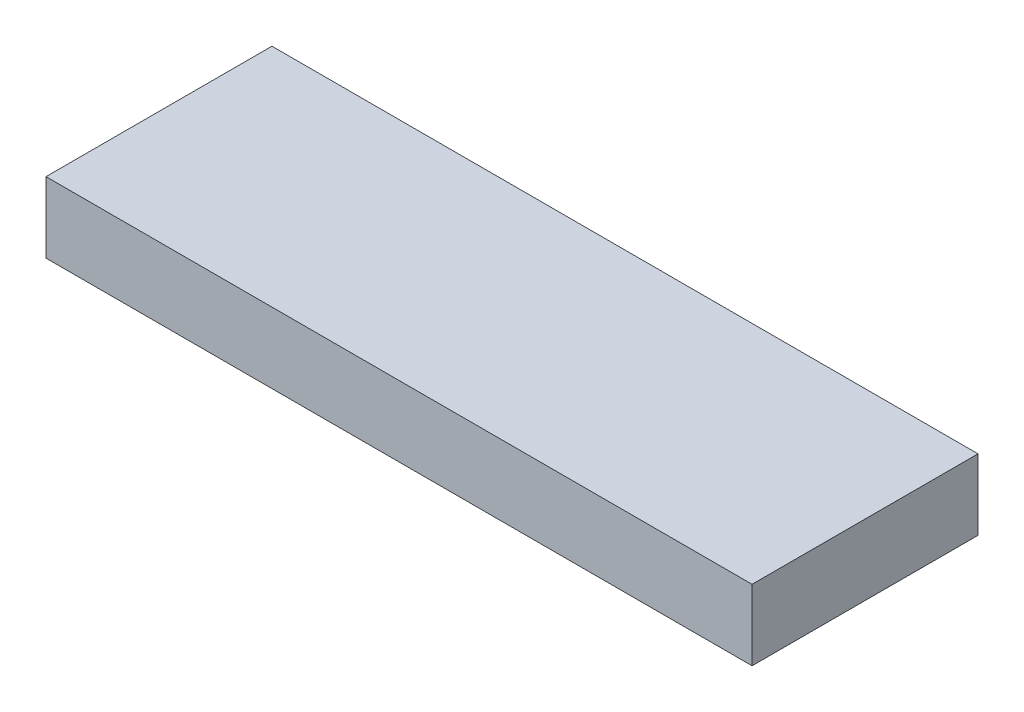
ISO-10303-21;
HEADER;
FILE_DESCRIPTION(('STEP AP214'),'2;1');
FILE_NAME('part.step','',(''),(''),'','','');
FILE_SCHEMA(('AUTOMOTIVE_DESIGN { 1 0 10303 214 1 1 1 1 }'));
ENDSEC;
DATA;
#1=APPLICATION_CONTEXT('core data for automotive mechanical design processes');
#2=APPLICATION_PROTOCOL_DEFINITION('international standard','automotive_design',2000,#1);
#3=PRODUCT_CONTEXT('',#1,'mechanical');
#4=PRODUCT('Part','Part','',(#3));
#5=PRODUCT_RELATED_PRODUCT_CATEGORY('part','',(#4));
#6=PRODUCT_DEFINITION_FORMATION('','',#4);
#7=PRODUCT_DEFINITION_CONTEXT('part definition',#1,'design');
#8=PRODUCT_DEFINITION('design','',#6,#7);
#9=PRODUCT_DEFINITION_SHAPE('','',#8);
#10=(LENGTH_UNIT() NAMED_UNIT(*) SI_UNIT(.MILLI.,.METRE.));
#11=(NAMED_UNIT(*) PLANE_ANGLE_UNIT() SI_UNIT($,.RADIAN.));
#12=(NAMED_UNIT(*) SI_UNIT($,.STERADIAN.) SOLID_ANGLE_UNIT());
#13=UNCERTAINTY_MEASURE_WITH_UNIT(LENGTH_MEASURE(1.E-05),#10,'distance_accuracy_value','');
#14=(GEOMETRIC_REPRESENTATION_CONTEXT(3) GLOBAL_UNCERTAINTY_ASSIGNED_CONTEXT((#13)) GLOBAL_UNIT_ASSIGNED_CONTEXT((#10,
#11,#12)) REPRESENTATION_CONTEXT('',''));
#15=CARTESIAN_POINT('',(0.,0.,0.));
#16=DIRECTION('',(0.,0.,1.));
#17=DIRECTION('',(1.,0.,0.));
#18=AXIS2_PLACEMENT_3D('',#15,#16,#17);
#19=CARTESIAN_POINT('',(50.,2.5,8.));
#20=DIRECTION('',(0.,0.,-1.));
#21=DIRECTION('',(-1.,0.,0.));
#22=AXIS2_PLACEMENT_3D('',#19,#20,#21);
#23=PLANE('',#22);
#24=DIRECTION('',(0.,-1.,0.));
#25=VECTOR('',#24,1.);
#26=CARTESIAN_POINT('',(0.,2.5,8.));
#27=LINE('',#26,#25);
#28=CARTESIAN_POINT('',(0.,2.5,8.));
#29=VERTEX_POINT('',#28);
#30=CARTESIAN_POINT('',(0.,-2.5,8.));
#31=VERTEX_POINT('',#30);
#32=EDGE_CURVE('E111',#29,#31,#27,.T.);
#33=ORIENTED_EDGE('',*,*,#32,.T.);
#34=DIRECTION('',(-1.,0.,0.));
#35=VECTOR('',#34,1.);
#36=CARTESIAN_POINT('',(50.,-2.5,8.));
#37=LINE('',#36,#35);
#38=CARTESIAN_POINT('',(50.,-2.5,8.));
#39=VERTEX_POINT('',#38);
#40=EDGE_CURVE('E11',#39,#31,#37,.T.);
#41=ORIENTED_EDGE('',*,*,#40,.F.);
#42=DIRECTION('',(0.,-1.,0.));
#43=VECTOR('',#42,1.);
#44=CARTESIAN_POINT('',(50.,2.5,8.));
#45=LINE('',#44,#43);
#46=CARTESIAN_POINT('',(50.,2.5,8.));
#47=VERTEX_POINT('',#46);
#48=EDGE_CURVE('E93',#47,#39,#45,.T.);
#49=ORIENTED_EDGE('',*,*,#48,.F.);
#50=DIRECTION('',(-1.,0.,0.));
#51=VECTOR('',#50,1.);
#52=CARTESIAN_POINT('',(50.,2.5,8.));
#53=LINE('',#52,#51);
#54=EDGE_CURVE('E60',#47,#29,#53,.T.);
#55=ORIENTED_EDGE('',*,*,#54,.T.);
#56=EDGE_LOOP('',(#33,#41,#49,#55));
#57=FACE_BOUND('',#56,.T.);
#58=ADVANCED_FACE('F43',(#57),#23,.F.);
#59=CARTESIAN_POINT('',(50.,-2.5,8.));
#60=DIRECTION('',(0.,1.,0.));
#61=DIRECTION('',(0.,0.,1.));
#62=AXIS2_PLACEMENT_3D('',#59,#60,#61);
#63=PLANE('',#62);
#64=DIRECTION('',(0.,0.,-1.));
#65=VECTOR('',#64,1.);
#66=CARTESIAN_POINT('',(0.,-2.5,8.));
#67=LINE('',#66,#65);
#68=CARTESIAN_POINT('',(0.,-2.5,-8.));
#69=VERTEX_POINT('',#68);
#70=EDGE_CURVE('E99',#31,#69,#67,.T.);
#71=ORIENTED_EDGE('',*,*,#70,.T.);
#72=DIRECTION('',(-1.,0.,0.));
#73=VECTOR('',#72,1.);
#74=CARTESIAN_POINT('',(50.,-2.5,-8.));
#75=LINE('',#74,#73);
#76=CARTESIAN_POINT('',(50.,-2.5,-8.));
#77=VERTEX_POINT('',#76);
#78=EDGE_CURVE('E52',#77,#69,#75,.T.);
#79=ORIENTED_EDGE('',*,*,#78,.F.);
#80=DIRECTION('',(0.,0.,-1.));
#81=VECTOR('',#80,1.);
#82=CARTESIAN_POINT('',(50.,-2.5,8.));
#83=LINE('',#82,#81);
#84=EDGE_CURVE('E85',#39,#77,#83,.T.);
#85=ORIENTED_EDGE('',*,*,#84,.F.);
#86=ORIENTED_EDGE('',*,*,#40,.T.);
#87=EDGE_LOOP('',(#71,#79,#85,#86));
#88=FACE_BOUND('',#87,.T.);
#89=ADVANCED_FACE('F98',(#88),#63,.F.);
#90=CARTESIAN_POINT('',(50.,2.5,-8.));
#91=DIRECTION('',(0.,0.,-1.));
#92=DIRECTION('',(0.,1.,0.));
#93=AXIS2_PLACEMENT_3D('',#90,#91,#92);
#94=PLANE('',#93);
#95=DIRECTION('',(0.,-1.,0.));
#96=VECTOR('',#95,1.);
#97=CARTESIAN_POINT('',(0.,2.5,-8.));
#98=LINE('',#97,#96);
#99=CARTESIAN_POINT('',(0.,2.5,-8.));
#100=VERTEX_POINT('',#99);
#101=EDGE_CURVE('E116',#100,#69,#98,.T.);
#102=ORIENTED_EDGE('',*,*,#101,.F.);
#103=DIRECTION('',(-1.,0.,0.));
#104=VECTOR('',#103,1.);
#105=CARTESIAN_POINT('',(50.,2.5,-8.));
#106=LINE('',#105,#104);
#107=CARTESIAN_POINT('',(50.,2.5,-8.));
#108=VERTEX_POINT('',#107);
#109=EDGE_CURVE('E74',#108,#100,#106,.T.);
#110=ORIENTED_EDGE('',*,*,#109,.F.);
#111=DIRECTION('',(0.,-1.,0.));
#112=VECTOR('',#111,1.);
#113=CARTESIAN_POINT('',(50.,2.5,-8.));
#114=LINE('',#113,#112);
#115=EDGE_CURVE('E92',#108,#77,#114,.T.);
#116=ORIENTED_EDGE('',*,*,#115,.T.);
#117=ORIENTED_EDGE('',*,*,#78,.T.);
#118=EDGE_LOOP('',(#102,#110,#116,#117));
#119=FACE_BOUND('',#118,.T.);
#120=ADVANCED_FACE('F103',(#119),#94,.T.);
#121=CARTESIAN_POINT('',(50.,2.5,8.));
#122=DIRECTION('',(0.,1.,0.));
#123=DIRECTION('',(0.,0.,1.));
#124=AXIS2_PLACEMENT_3D('',#121,#122,#123);
#125=PLANE('',#124);
#126=DIRECTION('',(0.,0.,-1.));
#127=VECTOR('',#126,1.);
#128=CARTESIAN_POINT('',(0.,2.5,8.));
#129=LINE('',#128,#127);
#130=EDGE_CURVE('E119',#29,#100,#129,.T.);
#131=ORIENTED_EDGE('',*,*,#130,.F.);
#132=ORIENTED_EDGE('',*,*,#54,.F.);
#133=DIRECTION('',(0.,0.,-1.));
#134=VECTOR('',#133,1.);
#135=CARTESIAN_POINT('',(50.,2.5,8.));
#136=LINE('',#135,#134);
#137=EDGE_CURVE('E105',#47,#108,#136,.T.);
#138=ORIENTED_EDGE('',*,*,#137,.T.);
#139=ORIENTED_EDGE('',*,*,#109,.T.);
#140=EDGE_LOOP('',(#131,#132,#138,#139));
#141=FACE_BOUND('',#140,.T.);
#142=ADVANCED_FACE('F129',(#141),#125,.T.);
#143=CARTESIAN_POINT('',(50.,0.,0.));
#144=DIRECTION('',(1.,0.,0.));
#145=DIRECTION('',(0.,0.,-1.));
#146=AXIS2_PLACEMENT_3D('',#143,#144,#145);
#147=PLANE('',#146);
#148=ORIENTED_EDGE('',*,*,#48,.T.);
#149=ORIENTED_EDGE('',*,*,#84,.T.);
#150=ORIENTED_EDGE('',*,*,#115,.F.);
#151=ORIENTED_EDGE('',*,*,#137,.F.);
#152=EDGE_LOOP('',(#148,#149,#150,#151));
#153=FACE_BOUND('',#152,.T.);
#154=ADVANCED_FACE('F89',(#153),#147,.T.);
#155=CARTESIAN_POINT('',(0.,0.,0.));
#156=DIRECTION('',(1.,0.,0.));
#157=DIRECTION('',(0.,0.,-1.));
#158=AXIS2_PLACEMENT_3D('',#155,#156,#157);
#159=PLANE('',#158);
#160=ORIENTED_EDGE('',*,*,#32,.F.);
#161=ORIENTED_EDGE('',*,*,#130,.T.);
#162=ORIENTED_EDGE('',*,*,#101,.T.);
#163=ORIENTED_EDGE('',*,*,#70,.F.);
#164=EDGE_LOOP('',(#160,#161,#162,#163));
#165=FACE_BOUND('',#164,.T.);
#166=ADVANCED_FACE('F128',(#165),#159,.F.);
#167=CLOSED_SHELL('',(#58,#89,#120,#142,#154,#166));
#168=MANIFOLD_SOLID_BREP('B2',#167);
#169=ADVANCED_BREP_SHAPE_REPRESENTATION('',(#18,#168),#14);
#170=SHAPE_DEFINITION_REPRESENTATION(#9,#169);
ENDSEC;
END-ISO-10303-21;
